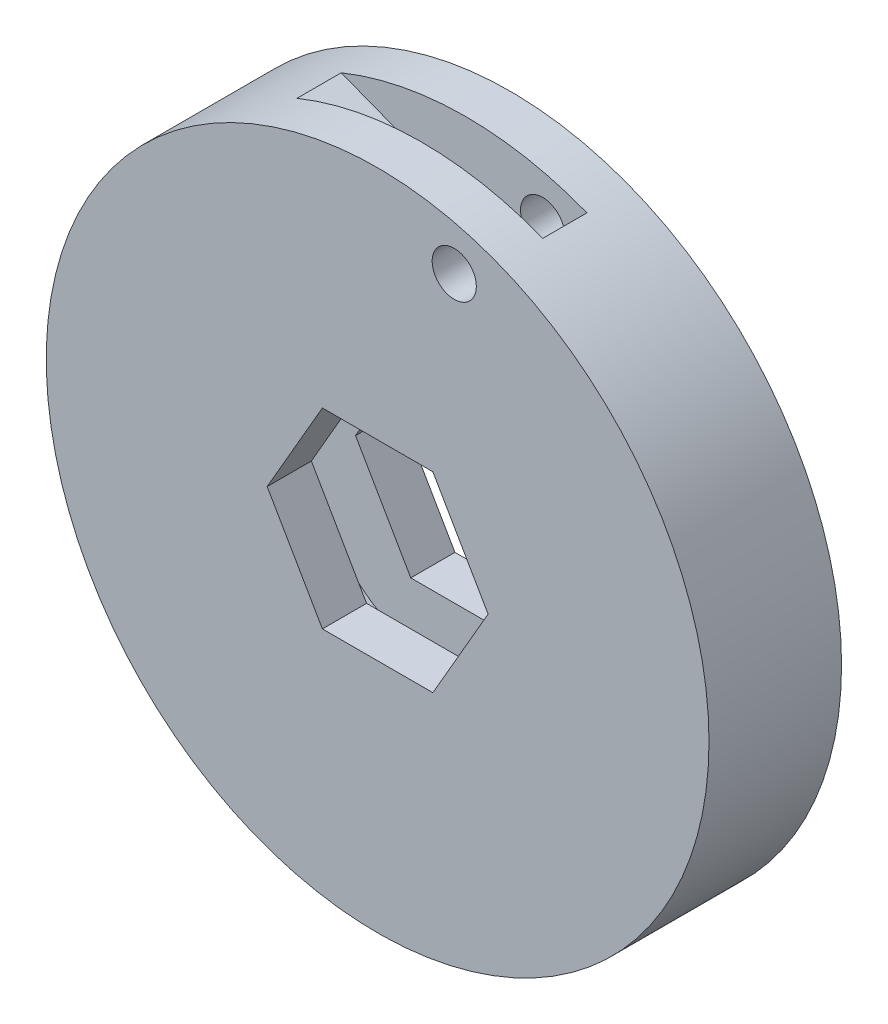
ISO-10303-21;
HEADER;
FILE_DESCRIPTION(('STEP AP214'),'2;1');
FILE_NAME('part.step','',(''),(''),'','','');
FILE_SCHEMA(('AUTOMOTIVE_DESIGN { 1 0 10303 214 1 1 1 1 }'));
ENDSEC;
DATA;
#1=APPLICATION_CONTEXT('core data for automotive mechanical design processes');
#2=APPLICATION_PROTOCOL_DEFINITION('international standard','automotive_design',2000,#1);
#3=PRODUCT_CONTEXT('',#1,'mechanical');
#4=PRODUCT('Part','Part','',(#3));
#5=PRODUCT_RELATED_PRODUCT_CATEGORY('part','',(#4));
#6=PRODUCT_DEFINITION_FORMATION('','',#4);
#7=PRODUCT_DEFINITION_CONTEXT('part definition',#1,'design');
#8=PRODUCT_DEFINITION('design','',#6,#7);
#9=PRODUCT_DEFINITION_SHAPE('','',#8);
#10=(LENGTH_UNIT() NAMED_UNIT(*) SI_UNIT(.MILLI.,.METRE.));
#11=(NAMED_UNIT(*) PLANE_ANGLE_UNIT() SI_UNIT($,.RADIAN.));
#12=(NAMED_UNIT(*) SI_UNIT($,.STERADIAN.) SOLID_ANGLE_UNIT());
#13=UNCERTAINTY_MEASURE_WITH_UNIT(LENGTH_MEASURE(1.E-05),#10,'distance_accuracy_value','');
#14=(GEOMETRIC_REPRESENTATION_CONTEXT(3) GLOBAL_UNCERTAINTY_ASSIGNED_CONTEXT((#13)) GLOBAL_UNIT_ASSIGNED_CONTEXT((#10,
#11,#12)) REPRESENTATION_CONTEXT('',''));
#15=CARTESIAN_POINT('',(0.,0.,0.));
#16=DIRECTION('',(0.,0.,1.));
#17=DIRECTION('',(1.,0.,0.));
#18=AXIS2_PLACEMENT_3D('',#15,#16,#17);
#19=CARTESIAN_POINT('',(5.46812116458275,12.5219631444568,0.));
#20=DIRECTION('',(0.999994073374145,-0.0034428500670208,0.));
#21=DIRECTION('',(0.00344285006702081,0.999994073374146,0.));
#22=AXIS2_PLACEMENT_3D('',#19,#20,#21);
#23=PLANE('',#22);
#24=DIRECTION('',(0.00344285006702081,0.999994073374146,0.));
#25=VECTOR('',#24,1.);
#26=CARTESIAN_POINT('',(5.46812116458275,12.5219631444568,2.));
#27=LINE('',#26,#25);
#28=CARTESIAN_POINT('',(5.46812116458275,12.5219631444568,2.));
#29=VERTEX_POINT('',#28);
#30=CARTESIAN_POINT('',(5.47309231627449,13.9658605355179,2.));
#31=VERTEX_POINT('',#30);
#32=EDGE_CURVE('E250',#29,#31,#27,.T.);
#33=ORIENTED_EDGE('',*,*,#32,.F.);
#34=DIRECTION('',(0.,0.,1.));
#35=VECTOR('',#34,1.);
#36=CARTESIAN_POINT('',(5.46812116458275,12.5219631444568,0.));
#37=LINE('',#36,#35);
#38=CARTESIAN_POINT('',(5.46812116458275,12.5219631444568,4.));
#39=VERTEX_POINT('',#38);
#40=EDGE_CURVE('E268',#29,#39,#37,.T.);
#41=ORIENTED_EDGE('',*,*,#40,.T.);
#42=DIRECTION('',(-0.00344285006702081,-0.999994073374146,0.));
#43=VECTOR('',#42,1.);
#44=CARTESIAN_POINT('',(5.46812116458275,12.5219631444568,4.));
#45=LINE('',#44,#43);
#46=CARTESIAN_POINT('',(5.47309231627449,13.9658605355179,4.));
#47=VERTEX_POINT('',#46);
#48=EDGE_CURVE('E261',#47,#39,#45,.T.);
#49=ORIENTED_EDGE('',*,*,#48,.F.);
#50=DIRECTION('',(0.,0.,1.));
#51=VECTOR('',#50,1.);
#52=CARTESIAN_POINT('',(5.47309231627449,13.9658605355179,0.));
#53=LINE('',#52,#51);
#54=EDGE_CURVE('E265',#31,#47,#53,.T.);
#55=ORIENTED_EDGE('',*,*,#54,.F.);
#56=EDGE_LOOP('',(#33,#41,#49,#55));
#57=FACE_BOUND('',#56,.T.);
#58=ADVANCED_FACE('F32',(#57),#23,.F.);
#59=CARTESIAN_POINT('',(3.46813301783446,12.5288488445909,0.));
#60=DIRECTION('',(0.,0.,1.));
#61=DIRECTION('',(1.,0.,0.));
#62=AXIS2_PLACEMENT_3D('',#59,#60,#61);
#63=CYLINDRICAL_SURFACE('',#62,2.);
#64=CARTESIAN_POINT('',(3.46813301783446,12.5288488445909,2.));
#65=DIRECTION('',(0.,0.,-1.));
#66=DIRECTION('',(-1.,0.,0.));
#67=AXIS2_PLACEMENT_3D('',#64,#65,#66);
#68=CIRCLE('',#67,2.);
#69=CARTESIAN_POINT('',(2.74967569722774,10.6623496941848,2.));
#70=VERTEX_POINT('',#69);
#71=EDGE_CURVE('E248',#70,#29,#68,.F.);
#72=ORIENTED_EDGE('',*,*,#71,.F.);
#73=DIRECTION('',(0.,0.,1.));
#74=VECTOR('',#73,1.);
#75=CARTESIAN_POINT('',(2.74967569722774,10.6623496941848,0.));
#76=LINE('',#75,#74);
#77=CARTESIAN_POINT('',(2.74967569722774,10.6623496941848,4.));
#78=VERTEX_POINT('',#77);
#79=EDGE_CURVE('E270',#70,#78,#76,.T.);
#80=ORIENTED_EDGE('',*,*,#79,.T.);
#81=CARTESIAN_POINT('',(3.46813301783446,12.5288488445909,4.));
#82=DIRECTION('',(0.,0.,1.));
#83=DIRECTION('',(1.,0.,0.));
#84=AXIS2_PLACEMENT_3D('',#81,#82,#83);
#85=CIRCLE('',#84,2.);
#86=EDGE_CURVE('E258',#39,#78,#85,.F.);
#87=ORIENTED_EDGE('',*,*,#86,.F.);
#88=ORIENTED_EDGE('',*,*,#40,.F.);
#89=EDGE_LOOP('',(#72,#80,#87,#88));
#90=FACE_BOUND('',#89,.T.);
#91=ADVANCED_FACE('F326',(#90),#63,.F.);
#92=CARTESIAN_POINT('',(-5.64957047959961,13.895407636915,0.));
#93=DIRECTION('',(-0.359228660303358,-0.93324957520304,0.));
#94=DIRECTION('',(0.93324957520304,-0.359228660303358,0.));
#95=AXIS2_PLACEMENT_3D('',#92,#93,#94);
#96=PLANE('',#95);
#97=DIRECTION('',(0.93324957520304,-0.359228660303358,0.));
#98=VECTOR('',#97,1.);
#99=CARTESIAN_POINT('',(-5.64957047959961,13.895407636915,2.));
#100=LINE('',#99,#98);
#101=CARTESIAN_POINT('',(-5.64957047959961,13.895407636915,2.));
#102=VERTEX_POINT('',#101);
#103=EDGE_CURVE('E241',#102,#70,#100,.T.);
#104=ORIENTED_EDGE('',*,*,#103,.F.);
#105=DIRECTION('',(0.,0.,1.));
#106=VECTOR('',#105,1.);
#107=CARTESIAN_POINT('',(-5.64957047959961,13.895407636915,0.));
#108=LINE('',#107,#106);
#109=CARTESIAN_POINT('',(-5.64957047959961,13.895407636915,4.));
#110=VERTEX_POINT('',#109);
#111=EDGE_CURVE('E264',#102,#110,#108,.T.);
#112=ORIENTED_EDGE('',*,*,#111,.T.);
#113=DIRECTION('',(-0.93324957520304,0.359228660303358,0.));
#114=VECTOR('',#113,1.);
#115=CARTESIAN_POINT('',(-5.64957047959961,13.895407636915,4.));
#116=LINE('',#115,#114);
#117=EDGE_CURVE('E255',#78,#110,#116,.T.);
#118=ORIENTED_EDGE('',*,*,#117,.F.);
#119=ORIENTED_EDGE('',*,*,#79,.F.);
#120=EDGE_LOOP('',(#104,#112,#118,#119));
#121=FACE_BOUND('',#120,.T.);
#122=ADVANCED_FACE('F332',(#121),#96,.F.);
#123=CARTESIAN_POINT('',(0.,0.,6.));
#124=DIRECTION('',(0.,0.,-1.));
#125=DIRECTION('',(-1.,0.,0.));
#126=AXIS2_PLACEMENT_3D('',#123,#124,#125);
#127=CYLINDRICAL_SURFACE('',#126,15.);
#128=CARTESIAN_POINT('',(0.,0.,2.));
#129=DIRECTION('',(0.,0.,-1.));
#130=DIRECTION('',(-1.,0.,0.));
#131=AXIS2_PLACEMENT_3D('',#128,#129,#130);
#132=CIRCLE('',#131,15.);
#133=EDGE_CURVE('E238',#102,#31,#132,.T.);
#134=ORIENTED_EDGE('',*,*,#133,.T.);
#135=ORIENTED_EDGE('',*,*,#54,.T.);
#136=CARTESIAN_POINT('',(0.,0.,4.));
#137=DIRECTION('',(0.,0.,1.));
#138=DIRECTION('',(1.,0.,0.));
#139=AXIS2_PLACEMENT_3D('',#136,#137,#138);
#140=CIRCLE('',#139,15.);
#141=EDGE_CURVE('E252',#47,#110,#140,.T.);
#142=ORIENTED_EDGE('',*,*,#141,.T.);
#143=ORIENTED_EDGE('',*,*,#111,.F.);
#144=EDGE_LOOP('',(#134,#135,#142,#143));
#145=FACE_BOUND('',#144,.T.);
#146=CARTESIAN_POINT('',(0.,0.,0.));
#147=DIRECTION('',(0.,0.,1.));
#148=DIRECTION('',(1.,0.,0.));
#149=AXIS2_PLACEMENT_3D('',#146,#147,#148);
#150=CIRCLE('',#149,15.);
#151=CARTESIAN_POINT('',(15.,0.,0.));
#152=VERTEX_POINT('',#151);
#153=EDGE_CURVE('E267',#152,#152,#150,.T.);
#154=ORIENTED_EDGE('',*,*,#153,.T.);
#155=EDGE_LOOP('',(#154));
#156=FACE_BOUND('',#155,.T.);
#157=CARTESIAN_POINT('',(0.,0.,6.));
#158=DIRECTION('',(0.,0.,1.));
#159=DIRECTION('',(1.,0.,0.));
#160=AXIS2_PLACEMENT_3D('',#157,#158,#159);
#161=CIRCLE('',#160,15.);
#162=CARTESIAN_POINT('',(15.,0.,6.));
#163=VERTEX_POINT('',#162);
#164=EDGE_CURVE('E273',#163,#163,#161,.T.);
#165=ORIENTED_EDGE('',*,*,#164,.F.);
#166=EDGE_LOOP('',(#165));
#167=FACE_BOUND('',#166,.T.);
#168=ADVANCED_FACE('F34',(#145,#156,#167),#127,.T.);
#169=CARTESIAN_POINT('',(0.,0.,6.));
#170=DIRECTION('',(0.,0.,1.));
#171=DIRECTION('',(1.,0.,0.));
#172=AXIS2_PLACEMENT_3D('',#169,#170,#171);
#173=PLANE('',#172);
#174=DIRECTION('',(1.,0.,0.));
#175=VECTOR('',#174,1.);
#176=CARTESIAN_POINT('',(-2.5,-4.33012701892219,6.));
#177=LINE('',#176,#175);
#178=CARTESIAN_POINT('',(-2.5,-4.33012701892219,6.));
#179=VERTEX_POINT('',#178);
#180=CARTESIAN_POINT('',(2.5,-4.33012701892219,6.));
#181=VERTEX_POINT('',#180);
#182=EDGE_CURVE('E47',#179,#181,#177,.T.);
#183=ORIENTED_EDGE('',*,*,#182,.F.);
#184=DIRECTION('',(0.5,-0.866025403784439,0.));
#185=VECTOR('',#184,1.);
#186=CARTESIAN_POINT('',(-5.,0.,6.));
#187=LINE('',#186,#185);
#188=CARTESIAN_POINT('',(-5.,0.,6.));
#189=VERTEX_POINT('',#188);
#190=EDGE_CURVE('E172',#189,#179,#187,.T.);
#191=ORIENTED_EDGE('',*,*,#190,.F.);
#192=DIRECTION('',(-0.5,-0.866025403784439,0.));
#193=VECTOR('',#192,1.);
#194=CARTESIAN_POINT('',(-2.5,4.33012701892219,6.));
#195=LINE('',#194,#193);
#196=CARTESIAN_POINT('',(-2.5,4.33012701892219,6.));
#197=VERTEX_POINT('',#196);
#198=EDGE_CURVE('E175',#197,#189,#195,.T.);
#199=ORIENTED_EDGE('',*,*,#198,.F.);
#200=DIRECTION('',(-1.,0.,0.));
#201=VECTOR('',#200,1.);
#202=CARTESIAN_POINT('',(2.5,4.33012701892219,6.));
#203=LINE('',#202,#201);
#204=CARTESIAN_POINT('',(2.5,4.33012701892219,6.));
#205=VERTEX_POINT('',#204);
#206=EDGE_CURVE('E192',#205,#197,#203,.T.);
#207=ORIENTED_EDGE('',*,*,#206,.F.);
#208=DIRECTION('',(-0.5,0.866025403784438,0.));
#209=VECTOR('',#208,1.);
#210=CARTESIAN_POINT('',(5.,0.,6.));
#211=LINE('',#210,#209);
#212=CARTESIAN_POINT('',(5.,0.,6.));
#213=VERTEX_POINT('',#212);
#214=EDGE_CURVE('E189',#213,#205,#211,.T.);
#215=ORIENTED_EDGE('',*,*,#214,.F.);
#216=DIRECTION('',(0.5,0.866025403784439,0.));
#217=VECTOR('',#216,1.);
#218=CARTESIAN_POINT('',(2.5,-4.33012701892219,6.));
#219=LINE('',#218,#217);
#220=EDGE_CURVE('E186',#181,#213,#219,.T.);
#221=ORIENTED_EDGE('',*,*,#220,.F.);
#222=EDGE_LOOP('',(#183,#191,#199,#207,#215,#221));
#223=FACE_BOUND('',#222,.T.);
#224=CARTESIAN_POINT('',(3.46813301783448,12.5725198680016,6.));
#225=DIRECTION('',(0.,0.,1.));
#226=DIRECTION('',(1.,0.,0.));
#227=AXIS2_PLACEMENT_3D('',#224,#225,#226);
#228=CIRCLE('',#227,1.);
#229=CARTESIAN_POINT('',(4.46813301783448,12.5725198680016,6.));
#230=VERTEX_POINT('',#229);
#231=EDGE_CURVE('E228',#230,#230,#228,.T.);
#232=ORIENTED_EDGE('',*,*,#231,.F.);
#233=EDGE_LOOP('',(#232));
#234=FACE_BOUND('',#233,.T.);
#235=ORIENTED_EDGE('',*,*,#164,.T.);
#236=EDGE_LOOP('',(#235));
#237=FACE_BOUND('',#236,.T.);
#238=ADVANCED_FACE('F307',(#223,#234,#237),#173,.T.);
#239=CARTESIAN_POINT('',(0.,0.,0.));
#240=DIRECTION('',(0.,0.,1.));
#241=DIRECTION('',(1.,0.,0.));
#242=AXIS2_PLACEMENT_3D('',#239,#240,#241);
#243=PLANE('',#242);
#244=DIRECTION('',(0.5,-0.866025403784439,0.));
#245=VECTOR('',#244,1.);
#246=CARTESIAN_POINT('',(-5.,0.,0.));
#247=LINE('',#246,#245);
#248=CARTESIAN_POINT('',(-5.,0.,0.));
#249=VERTEX_POINT('',#248);
#250=CARTESIAN_POINT('',(-2.5,-4.33012701892219,0.));
#251=VERTEX_POINT('',#250);
#252=EDGE_CURVE('E171',#249,#251,#247,.T.);
#253=ORIENTED_EDGE('',*,*,#252,.T.);
#254=DIRECTION('',(1.,0.,0.));
#255=VECTOR('',#254,1.);
#256=CARTESIAN_POINT('',(-2.5,-4.33012701892219,0.));
#257=LINE('',#256,#255);
#258=CARTESIAN_POINT('',(2.5,-4.33012701892219,0.));
#259=VERTEX_POINT('',#258);
#260=EDGE_CURVE('E152',#251,#259,#257,.T.);
#261=ORIENTED_EDGE('',*,*,#260,.T.);
#262=DIRECTION('',(0.5,0.866025403784439,0.));
#263=VECTOR('',#262,1.);
#264=CARTESIAN_POINT('',(2.5,-4.33012701892219,0.));
#265=LINE('',#264,#263);
#266=CARTESIAN_POINT('',(5.,0.,0.));
#267=VERTEX_POINT('',#266);
#268=EDGE_CURVE('E162',#259,#267,#265,.T.);
#269=ORIENTED_EDGE('',*,*,#268,.T.);
#270=DIRECTION('',(-0.5,0.866025403784438,0.));
#271=VECTOR('',#270,1.);
#272=CARTESIAN_POINT('',(5.,0.,0.));
#273=LINE('',#272,#271);
#274=CARTESIAN_POINT('',(2.5,4.33012701892219,0.));
#275=VERTEX_POINT('',#274);
#276=EDGE_CURVE('E55',#267,#275,#273,.T.);
#277=ORIENTED_EDGE('',*,*,#276,.T.);
#278=DIRECTION('',(-1.,0.,0.));
#279=VECTOR('',#278,1.);
#280=CARTESIAN_POINT('',(2.5,4.33012701892219,0.));
#281=LINE('',#280,#279);
#282=CARTESIAN_POINT('',(-2.5,4.33012701892219,0.));
#283=VERTEX_POINT('',#282);
#284=EDGE_CURVE('E179',#275,#283,#281,.T.);
#285=ORIENTED_EDGE('',*,*,#284,.T.);
#286=DIRECTION('',(-0.5,-0.866025403784439,0.));
#287=VECTOR('',#286,1.);
#288=CARTESIAN_POINT('',(-2.5,4.33012701892219,0.));
#289=LINE('',#288,#287);
#290=EDGE_CURVE('E182',#283,#249,#289,.T.);
#291=ORIENTED_EDGE('',*,*,#290,.T.);
#292=EDGE_LOOP('',(#253,#261,#269,#277,#285,#291));
#293=FACE_BOUND('',#292,.T.);
#294=CARTESIAN_POINT('',(3.46813301783448,12.5725198680016,0.));
#295=DIRECTION('',(0.,0.,1.));
#296=DIRECTION('',(1.,0.,0.));
#297=AXIS2_PLACEMENT_3D('',#294,#295,#296);
#298=CIRCLE('',#297,1.);
#299=CARTESIAN_POINT('',(4.46813301783448,12.5725198680016,0.));
#300=VERTEX_POINT('',#299);
#301=EDGE_CURVE('E231',#300,#300,#298,.T.);
#302=ORIENTED_EDGE('',*,*,#301,.T.);
#303=EDGE_LOOP('',(#302));
#304=FACE_BOUND('',#303,.T.);
#305=ORIENTED_EDGE('',*,*,#153,.F.);
#306=EDGE_LOOP('',(#305));
#307=FACE_BOUND('',#306,.T.);
#308=ADVANCED_FACE('F167',(#293,#304,#307),#243,.F.);
#309=CARTESIAN_POINT('',(0.,0.,4.));
#310=DIRECTION('',(0.,0.,1.));
#311=DIRECTION('',(1.,0.,0.));
#312=AXIS2_PLACEMENT_3D('',#309,#310,#311);
#313=PLANE('',#312);
#314=CARTESIAN_POINT('',(3.46813301783448,12.5725198680016,4.));
#315=DIRECTION('',(0.,0.,1.));
#316=DIRECTION('',(1.,0.,0.));
#317=AXIS2_PLACEMENT_3D('',#314,#315,#316);
#318=CIRCLE('',#317,1.);
#319=CARTESIAN_POINT('',(4.46813301783448,12.5725198680016,4.));
#320=VERTEX_POINT('',#319);
#321=EDGE_CURVE('E235',#320,#320,#318,.T.);
#322=ORIENTED_EDGE('',*,*,#321,.T.);
#323=EDGE_LOOP('',(#322));
#324=FACE_BOUND('',#323,.T.);
#325=ORIENTED_EDGE('',*,*,#141,.F.);
#326=ORIENTED_EDGE('',*,*,#48,.T.);
#327=ORIENTED_EDGE('',*,*,#86,.T.);
#328=ORIENTED_EDGE('',*,*,#117,.T.);
#329=EDGE_LOOP('',(#325,#326,#327,#328));
#330=FACE_BOUND('',#329,.T.);
#331=ADVANCED_FACE('F345',(#324,#330),#313,.F.);
#332=CARTESIAN_POINT('',(0.,0.,2.));
#333=DIRECTION('',(0.,0.,-1.));
#334=DIRECTION('',(-1.,0.,0.));
#335=AXIS2_PLACEMENT_3D('',#332,#333,#334);
#336=PLANE('',#335);
#337=CARTESIAN_POINT('',(3.46813301783448,12.5725198680016,2.));
#338=DIRECTION('',(0.,0.,-1.));
#339=DIRECTION('',(-1.,0.,0.));
#340=AXIS2_PLACEMENT_3D('',#337,#338,#339);
#341=CIRCLE('',#340,1.);
#342=CARTESIAN_POINT('',(2.46813301783448,12.5725198680016,2.));
#343=VERTEX_POINT('',#342);
#344=EDGE_CURVE('E234',#343,#343,#341,.T.);
#345=ORIENTED_EDGE('',*,*,#344,.T.);
#346=EDGE_LOOP('',(#345));
#347=FACE_BOUND('',#346,.T.);
#348=ORIENTED_EDGE('',*,*,#71,.T.);
#349=ORIENTED_EDGE('',*,*,#32,.T.);
#350=ORIENTED_EDGE('',*,*,#133,.F.);
#351=ORIENTED_EDGE('',*,*,#103,.T.);
#352=EDGE_LOOP('',(#348,#349,#350,#351));
#353=FACE_BOUND('',#352,.T.);
#354=ADVANCED_FACE('F350',(#347,#353),#336,.F.);
#355=CARTESIAN_POINT('',(3.46813301783448,12.5725198680016,0.));
#356=DIRECTION('',(0.,0.,1.));
#357=DIRECTION('',(1.,0.,0.));
#358=AXIS2_PLACEMENT_3D('',#355,#356,#357);
#359=CYLINDRICAL_SURFACE('',#358,1.);
#360=ORIENTED_EDGE('',*,*,#301,.F.);
#361=EDGE_LOOP('',(#360));
#362=FACE_BOUND('',#361,.T.);
#363=ORIENTED_EDGE('',*,*,#344,.F.);
#364=EDGE_LOOP('',(#363));
#365=FACE_BOUND('',#364,.T.);
#366=ADVANCED_FACE('F355',(#362,#365),#359,.F.);
#367=ORIENTED_EDGE('',*,*,#231,.T.);
#368=EDGE_LOOP('',(#367));
#369=FACE_BOUND('',#368,.T.);
#370=ORIENTED_EDGE('',*,*,#321,.F.);
#371=EDGE_LOOP('',(#370));
#372=FACE_BOUND('',#371,.T.);
#373=ADVANCED_FACE('F373',(#369,#372),#359,.F.);
#374=CARTESIAN_POINT('',(2.5,-4.33012701892219,0.));
#375=DIRECTION('',(0.866025403784439,-0.5,0.));
#376=DIRECTION('',(0.5,0.866025403784439,0.));
#377=AXIS2_PLACEMENT_3D('',#374,#375,#376);
#378=PLANE('',#377);
#379=DIRECTION('',(0.,0.,1.));
#380=VECTOR('',#379,1.);
#381=CARTESIAN_POINT('',(2.5,-4.33012701892219,0.));
#382=LINE('',#381,#380);
#383=CARTESIAN_POINT('',(2.5,-4.33012701892219,4.));
#384=VERTEX_POINT('',#383);
#385=EDGE_CURVE('E159',#384,#181,#382,.T.);
#386=ORIENTED_EDGE('',*,*,#385,.T.);
#387=ORIENTED_EDGE('',*,*,#220,.T.);
#388=DIRECTION('',(0.,0.,1.));
#389=VECTOR('',#388,1.);
#390=CARTESIAN_POINT('',(5.,0.,0.));
#391=LINE('',#390,#389);
#392=CARTESIAN_POINT('',(5.,0.,4.));
#393=VERTEX_POINT('',#392);
#394=EDGE_CURVE('E158',#393,#213,#391,.T.);
#395=ORIENTED_EDGE('',*,*,#394,.F.);
#396=DIRECTION('',(0.5,0.866025403784439,0.));
#397=VECTOR('',#396,1.);
#398=CARTESIAN_POINT('',(3.75,-2.1650635094611,4.));
#399=LINE('',#398,#397);
#400=EDGE_CURVE('E245',#384,#393,#399,.T.);
#401=ORIENTED_EDGE('',*,*,#400,.F.);
#402=EDGE_LOOP('',(#386,#387,#395,#401));
#403=FACE_BOUND('',#402,.T.);
#404=ADVANCED_FACE('F312',(#403),#378,.F.);
#405=CARTESIAN_POINT('',(5.,0.,0.));
#406=DIRECTION('',(0.866025403784438,0.5,0.));
#407=DIRECTION('',(-0.5,0.866025403784439,0.));
#408=AXIS2_PLACEMENT_3D('',#405,#406,#407);
#409=PLANE('',#408);
#410=ORIENTED_EDGE('',*,*,#394,.T.);
#411=ORIENTED_EDGE('',*,*,#214,.T.);
#412=DIRECTION('',(0.,0.,1.));
#413=VECTOR('',#412,1.);
#414=CARTESIAN_POINT('',(2.5,4.33012701892219,0.));
#415=LINE('',#414,#413);
#416=CARTESIAN_POINT('',(2.5,4.33012701892219,4.));
#417=VERTEX_POINT('',#416);
#418=EDGE_CURVE('E212',#417,#205,#415,.T.);
#419=ORIENTED_EDGE('',*,*,#418,.F.);
#420=DIRECTION('',(-0.5,0.866025403784439,0.));
#421=VECTOR('',#420,1.);
#422=CARTESIAN_POINT('',(3.75,2.1650635094611,4.));
#423=LINE('',#422,#421);
#424=EDGE_CURVE('E284',#393,#417,#423,.T.);
#425=ORIENTED_EDGE('',*,*,#424,.F.);
#426=EDGE_LOOP('',(#410,#411,#419,#425));
#427=FACE_BOUND('',#426,.T.);
#428=ADVANCED_FACE('F380',(#427),#409,.F.);
#429=CARTESIAN_POINT('',(2.5,4.33012701892219,0.));
#430=DIRECTION('',(0.,1.,0.));
#431=DIRECTION('',(-1.,0.,0.));
#432=AXIS2_PLACEMENT_3D('',#429,#430,#431);
#433=PLANE('',#432);
#434=ORIENTED_EDGE('',*,*,#418,.T.);
#435=ORIENTED_EDGE('',*,*,#206,.T.);
#436=DIRECTION('',(0.,0.,1.));
#437=VECTOR('',#436,1.);
#438=CARTESIAN_POINT('',(-2.5,4.33012701892219,0.));
#439=LINE('',#438,#437);
#440=CARTESIAN_POINT('',(-2.5,4.33012701892219,4.));
#441=VERTEX_POINT('',#440);
#442=EDGE_CURVE('E208',#441,#197,#439,.T.);
#443=ORIENTED_EDGE('',*,*,#442,.F.);
#444=DIRECTION('',(-1.,0.,0.));
#445=VECTOR('',#444,1.);
#446=CARTESIAN_POINT('',(0.,4.33012701892219,4.));
#447=LINE('',#446,#445);
#448=EDGE_CURVE('E287',#417,#441,#447,.T.);
#449=ORIENTED_EDGE('',*,*,#448,.F.);
#450=EDGE_LOOP('',(#434,#435,#443,#449));
#451=FACE_BOUND('',#450,.T.);
#452=ADVANCED_FACE('F458',(#451),#433,.F.);
#453=CARTESIAN_POINT('',(-2.5,4.33012701892219,0.));
#454=DIRECTION('',(-0.866025403784439,0.5,0.));
#455=DIRECTION('',(-0.5,-0.866025403784439,0.));
#456=AXIS2_PLACEMENT_3D('',#453,#454,#455);
#457=PLANE('',#456);
#458=ORIENTED_EDGE('',*,*,#442,.T.);
#459=ORIENTED_EDGE('',*,*,#198,.T.);
#460=DIRECTION('',(0.,0.,1.));
#461=VECTOR('',#460,1.);
#462=CARTESIAN_POINT('',(-5.,0.,0.));
#463=LINE('',#462,#461);
#464=CARTESIAN_POINT('',(-5.,0.,4.));
#465=VERTEX_POINT('',#464);
#466=EDGE_CURVE('E204',#465,#189,#463,.T.);
#467=ORIENTED_EDGE('',*,*,#466,.F.);
#468=DIRECTION('',(-0.5,-0.866025403784439,0.));
#469=VECTOR('',#468,1.);
#470=CARTESIAN_POINT('',(-3.75,2.1650635094611,4.));
#471=LINE('',#470,#469);
#472=EDGE_CURVE('E290',#441,#465,#471,.T.);
#473=ORIENTED_EDGE('',*,*,#472,.F.);
#474=EDGE_LOOP('',(#458,#459,#467,#473));
#475=FACE_BOUND('',#474,.T.);
#476=ADVANCED_FACE('F301',(#475),#457,.F.);
#477=CARTESIAN_POINT('',(-5.,0.,0.));
#478=DIRECTION('',(-0.866025403784439,-0.5,0.));
#479=DIRECTION('',(0.5,-0.866025403784439,0.));
#480=AXIS2_PLACEMENT_3D('',#477,#478,#479);
#481=PLANE('',#480);
#482=ORIENTED_EDGE('',*,*,#466,.T.);
#483=ORIENTED_EDGE('',*,*,#190,.T.);
#484=DIRECTION('',(0.,0.,1.));
#485=VECTOR('',#484,1.);
#486=CARTESIAN_POINT('',(-2.5,-4.33012701892219,0.));
#487=LINE('',#486,#485);
#488=CARTESIAN_POINT('',(-2.5,-4.33012701892219,4.));
#489=VERTEX_POINT('',#488);
#490=EDGE_CURVE('E200',#489,#179,#487,.T.);
#491=ORIENTED_EDGE('',*,*,#490,.F.);
#492=DIRECTION('',(0.5,-0.866025403784439,0.));
#493=VECTOR('',#492,1.);
#494=CARTESIAN_POINT('',(-3.75,-2.1650635094611,4.));
#495=LINE('',#494,#493);
#496=EDGE_CURVE('E40',#465,#489,#495,.T.);
#497=ORIENTED_EDGE('',*,*,#496,.F.);
#498=EDGE_LOOP('',(#482,#483,#491,#497));
#499=FACE_BOUND('',#498,.T.);
#500=ADVANCED_FACE('F299',(#499),#481,.F.);
#501=CARTESIAN_POINT('',(-2.5,-4.33012701892219,0.));
#502=DIRECTION('',(0.,-1.,0.));
#503=DIRECTION('',(0.,0.,-1.));
#504=AXIS2_PLACEMENT_3D('',#501,#502,#503);
#505=PLANE('',#504);
#506=ORIENTED_EDGE('',*,*,#490,.T.);
#507=ORIENTED_EDGE('',*,*,#182,.T.);
#508=ORIENTED_EDGE('',*,*,#385,.F.);
#509=DIRECTION('',(1.,0.,0.));
#510=VECTOR('',#509,1.);
#511=CARTESIAN_POINT('',(0.,-4.33012701892219,4.));
#512=LINE('',#511,#510);
#513=EDGE_CURVE('E11',#489,#384,#512,.T.);
#514=ORIENTED_EDGE('',*,*,#513,.F.);
#515=EDGE_LOOP('',(#506,#507,#508,#514));
#516=FACE_BOUND('',#515,.T.);
#517=ADVANCED_FACE('F314',(#516),#505,.F.);
#518=CARTESIAN_POINT('',(2.5,-4.33012701892219,2.));
#519=VERTEX_POINT('',#518);
#520=EDGE_CURVE('E147',#259,#519,#382,.T.);
#521=ORIENTED_EDGE('',*,*,#520,.F.);
#522=ORIENTED_EDGE('',*,*,#260,.F.);
#523=CARTESIAN_POINT('',(-2.5,-4.33012701892219,2.));
#524=VERTEX_POINT('',#523);
#525=EDGE_CURVE('E197',#251,#524,#487,.T.);
#526=ORIENTED_EDGE('',*,*,#525,.T.);
#527=DIRECTION('',(-1.,0.,0.));
#528=VECTOR('',#527,1.);
#529=CARTESIAN_POINT('',(0.,-4.33012701892219,2.));
#530=LINE('',#529,#528);
#531=EDGE_CURVE('E155',#519,#524,#530,.T.);
#532=ORIENTED_EDGE('',*,*,#531,.F.);
#533=EDGE_LOOP('',(#521,#522,#526,#532));
#534=FACE_BOUND('',#533,.T.);
#535=ADVANCED_FACE('F149',(#534),#505,.F.);
#536=ORIENTED_EDGE('',*,*,#525,.F.);
#537=ORIENTED_EDGE('',*,*,#252,.F.);
#538=CARTESIAN_POINT('',(-5.,0.,2.));
#539=VERTEX_POINT('',#538);
#540=EDGE_CURVE('E201',#249,#539,#463,.T.);
#541=ORIENTED_EDGE('',*,*,#540,.T.);
#542=DIRECTION('',(-0.5,0.866025403784439,0.));
#543=VECTOR('',#542,1.);
#544=CARTESIAN_POINT('',(-3.75,-2.1650635094611,2.));
#545=LINE('',#544,#543);
#546=EDGE_CURVE('E224',#524,#539,#545,.T.);
#547=ORIENTED_EDGE('',*,*,#546,.F.);
#548=EDGE_LOOP('',(#536,#537,#541,#547));
#549=FACE_BOUND('',#548,.T.);
#550=ADVANCED_FACE('F321',(#549),#481,.F.);
#551=ORIENTED_EDGE('',*,*,#540,.F.);
#552=ORIENTED_EDGE('',*,*,#290,.F.);
#553=CARTESIAN_POINT('',(-2.5,4.33012701892219,2.));
#554=VERTEX_POINT('',#553);
#555=EDGE_CURVE('E205',#283,#554,#439,.T.);
#556=ORIENTED_EDGE('',*,*,#555,.T.);
#557=DIRECTION('',(0.5,0.866025403784439,0.));
#558=VECTOR('',#557,1.);
#559=CARTESIAN_POINT('',(-3.75,2.1650635094611,2.));
#560=LINE('',#559,#558);
#561=EDGE_CURVE('E221',#539,#554,#560,.T.);
#562=ORIENTED_EDGE('',*,*,#561,.F.);
#563=EDGE_LOOP('',(#551,#552,#556,#562));
#564=FACE_BOUND('',#563,.T.);
#565=ADVANCED_FACE('F477',(#564),#457,.F.);
#566=ORIENTED_EDGE('',*,*,#555,.F.);
#567=ORIENTED_EDGE('',*,*,#284,.F.);
#568=CARTESIAN_POINT('',(2.5,4.33012701892219,2.));
#569=VERTEX_POINT('',#568);
#570=EDGE_CURVE('E209',#275,#569,#415,.T.);
#571=ORIENTED_EDGE('',*,*,#570,.T.);
#572=DIRECTION('',(1.,0.,0.));
#573=VECTOR('',#572,1.);
#574=CARTESIAN_POINT('',(0.,4.33012701892219,2.));
#575=LINE('',#574,#573);
#576=EDGE_CURVE('E218',#554,#569,#575,.T.);
#577=ORIENTED_EDGE('',*,*,#576,.F.);
#578=EDGE_LOOP('',(#566,#567,#571,#577));
#579=FACE_BOUND('',#578,.T.);
#580=ADVANCED_FACE('F469',(#579),#433,.F.);
#581=ORIENTED_EDGE('',*,*,#570,.F.);
#582=ORIENTED_EDGE('',*,*,#276,.F.);
#583=CARTESIAN_POINT('',(5.,0.,2.));
#584=VERTEX_POINT('',#583);
#585=EDGE_CURVE('E164',#267,#584,#391,.T.);
#586=ORIENTED_EDGE('',*,*,#585,.T.);
#587=DIRECTION('',(0.5,-0.866025403784439,0.));
#588=VECTOR('',#587,1.);
#589=CARTESIAN_POINT('',(3.75,2.1650635094611,2.));
#590=LINE('',#589,#588);
#591=EDGE_CURVE('E215',#569,#584,#590,.T.);
#592=ORIENTED_EDGE('',*,*,#591,.F.);
#593=EDGE_LOOP('',(#581,#582,#586,#592));
#594=FACE_BOUND('',#593,.T.);
#595=ADVANCED_FACE('F371',(#594),#409,.F.);
#596=ORIENTED_EDGE('',*,*,#585,.F.);
#597=ORIENTED_EDGE('',*,*,#268,.F.);
#598=ORIENTED_EDGE('',*,*,#520,.T.);
#599=DIRECTION('',(-0.5,-0.866025403784439,0.));
#600=VECTOR('',#599,1.);
#601=CARTESIAN_POINT('',(3.75,-2.1650635094611,2.));
#602=LINE('',#601,#600);
#603=EDGE_CURVE('E199',#584,#519,#602,.T.);
#604=ORIENTED_EDGE('',*,*,#603,.F.);
#605=EDGE_LOOP('',(#596,#597,#598,#604));
#606=FACE_BOUND('',#605,.T.);
#607=ADVANCED_FACE('F163',(#606),#378,.F.);
#608=ORIENTED_EDGE('',*,*,#603,.T.);
#609=ORIENTED_EDGE('',*,*,#531,.T.);
#610=ORIENTED_EDGE('',*,*,#546,.T.);
#611=ORIENTED_EDGE('',*,*,#561,.T.);
#612=ORIENTED_EDGE('',*,*,#576,.T.);
#613=ORIENTED_EDGE('',*,*,#591,.T.);
#614=EDGE_LOOP('',(#608,#609,#610,#611,#612,#613));
#615=FACE_BOUND('',#614,.T.);
#616=CARTESIAN_POINT('',(0.,0.,2.));
#617=DIRECTION('',(0.,0.,-1.));
#618=DIRECTION('',(-1.,0.,0.));
#619=AXIS2_PLACEMENT_3D('',#616,#617,#618);
#620=CIRCLE('',#619,7.5);
#621=CARTESIAN_POINT('',(-7.5,0.,2.));
#622=VERTEX_POINT('',#621);
#623=EDGE_CURVE('E242',#622,#622,#620,.F.);
#624=ORIENTED_EDGE('',*,*,#623,.T.);
#625=EDGE_LOOP('',(#624));
#626=FACE_BOUND('',#625,.T.);
#627=ADVANCED_FACE('F358',(#615,#626),#336,.F.);
#628=ORIENTED_EDGE('',*,*,#496,.T.);
#629=ORIENTED_EDGE('',*,*,#513,.T.);
#630=ORIENTED_EDGE('',*,*,#400,.T.);
#631=ORIENTED_EDGE('',*,*,#424,.T.);
#632=ORIENTED_EDGE('',*,*,#448,.T.);
#633=ORIENTED_EDGE('',*,*,#472,.T.);
#634=EDGE_LOOP('',(#628,#629,#630,#631,#632,#633));
#635=FACE_BOUND('',#634,.T.);
#636=CARTESIAN_POINT('',(0.,0.,4.));
#637=DIRECTION('',(0.,0.,1.));
#638=DIRECTION('',(1.,0.,0.));
#639=AXIS2_PLACEMENT_3D('',#636,#637,#638);
#640=CIRCLE('',#639,7.5);
#641=CARTESIAN_POINT('',(7.5,0.,4.));
#642=VERTEX_POINT('',#641);
#643=EDGE_CURVE('E246',#642,#642,#640,.F.);
#644=ORIENTED_EDGE('',*,*,#643,.T.);
#645=EDGE_LOOP('',(#644));
#646=FACE_BOUND('',#645,.T.);
#647=ADVANCED_FACE('F294',(#635,#646),#313,.F.);
#648=CARTESIAN_POINT('',(0.,0.,0.));
#649=DIRECTION('',(0.,0.,1.));
#650=DIRECTION('',(1.,0.,0.));
#651=AXIS2_PLACEMENT_3D('',#648,#649,#650);
#652=CYLINDRICAL_SURFACE('',#651,7.5);
#653=ORIENTED_EDGE('',*,*,#643,.F.);
#654=EDGE_LOOP('',(#653));
#655=FACE_BOUND('',#654,.T.);
#656=ORIENTED_EDGE('',*,*,#623,.F.);
#657=EDGE_LOOP('',(#656));
#658=FACE_BOUND('',#657,.T.);
#659=ADVANCED_FACE('F337',(#655,#658),#652,.F.);
#660=CLOSED_SHELL('',(#58,#91,#122,#168,#238,#308,#331,#354,#366,#373,#404,#428,#452,#476,#500,
#517,#535,#550,#565,#580,#595,#607,#627,#647,#659));
#661=MANIFOLD_SOLID_BREP('B2',#660);
#662=ADVANCED_BREP_SHAPE_REPRESENTATION('',(#18,#661),#14);
#663=SHAPE_DEFINITION_REPRESENTATION(#9,#662);
ENDSEC;
END-ISO-10303-21;
